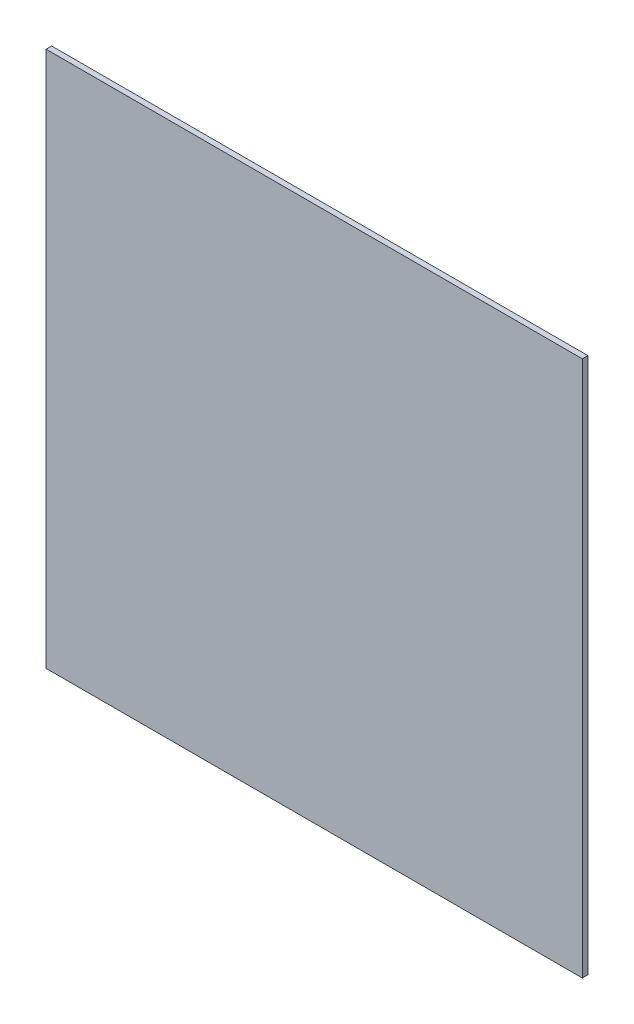
ISO-10303-21;
HEADER;
FILE_DESCRIPTION(('STEP AP214'),'2;1');
FILE_NAME('part.step','',(''),(''),'','','');
FILE_SCHEMA(('AUTOMOTIVE_DESIGN { 1 0 10303 214 1 1 1 1 }'));
ENDSEC;
DATA;
#1=APPLICATION_CONTEXT('core data for automotive mechanical design processes');
#2=APPLICATION_PROTOCOL_DEFINITION('international standard','automotive_design',2000,#1);
#3=PRODUCT_CONTEXT('',#1,'mechanical');
#4=PRODUCT('Part','Part','',(#3));
#5=PRODUCT_RELATED_PRODUCT_CATEGORY('part','',(#4));
#6=PRODUCT_DEFINITION_FORMATION('','',#4);
#7=PRODUCT_DEFINITION_CONTEXT('part definition',#1,'design');
#8=PRODUCT_DEFINITION('design','',#6,#7);
#9=PRODUCT_DEFINITION_SHAPE('','',#8);
#10=(LENGTH_UNIT() NAMED_UNIT(*) SI_UNIT(.MILLI.,.METRE.));
#11=(NAMED_UNIT(*) PLANE_ANGLE_UNIT() SI_UNIT($,.RADIAN.));
#12=(NAMED_UNIT(*) SI_UNIT($,.STERADIAN.) SOLID_ANGLE_UNIT());
#13=UNCERTAINTY_MEASURE_WITH_UNIT(LENGTH_MEASURE(1.E-05),#10,'distance_accuracy_value','');
#14=(GEOMETRIC_REPRESENTATION_CONTEXT(3) GLOBAL_UNCERTAINTY_ASSIGNED_CONTEXT((#13)) GLOBAL_UNIT_ASSIGNED_CONTEXT((#10,
#11,#12)) REPRESENTATION_CONTEXT('',''));
#15=CARTESIAN_POINT('',(0.,0.,0.));
#16=DIRECTION('',(0.,0.,1.));
#17=DIRECTION('',(1.,0.,0.));
#18=AXIS2_PLACEMENT_3D('',#15,#16,#17);
#19=CARTESIAN_POINT('',(1200.,-1200.,25.));
#20=DIRECTION('',(-1.,0.,0.));
#21=DIRECTION('',(0.,0.,1.));
#22=AXIS2_PLACEMENT_3D('',#19,#20,#21);
#23=PLANE('',#22);
#24=DIRECTION('',(0.,1.,0.));
#25=VECTOR('',#24,1.);
#26=CARTESIAN_POINT('',(1200.,-1200.,0.));
#27=LINE('',#26,#25);
#28=CARTESIAN_POINT('',(1200.,-1200.,0.));
#29=VERTEX_POINT('',#28);
#30=CARTESIAN_POINT('',(1200.,1200.,0.));
#31=VERTEX_POINT('',#30);
#32=EDGE_CURVE('E113',#29,#31,#27,.T.);
#33=ORIENTED_EDGE('',*,*,#32,.T.);
#34=DIRECTION('',(0.,0.,-1.));
#35=VECTOR('',#34,1.);
#36=CARTESIAN_POINT('',(1200.,1200.,25.));
#37=LINE('',#36,#35);
#38=CARTESIAN_POINT('',(1200.,1200.,25.));
#39=VERTEX_POINT('',#38);
#40=EDGE_CURVE('E11',#39,#31,#37,.T.);
#41=ORIENTED_EDGE('',*,*,#40,.F.);
#42=DIRECTION('',(0.,1.,0.));
#43=VECTOR('',#42,1.);
#44=CARTESIAN_POINT('',(1200.,-1200.,25.));
#45=LINE('',#44,#43);
#46=CARTESIAN_POINT('',(1200.,-1200.,25.));
#47=VERTEX_POINT('',#46);
#48=EDGE_CURVE('E97',#47,#39,#45,.T.);
#49=ORIENTED_EDGE('',*,*,#48,.F.);
#50=DIRECTION('',(0.,0.,-1.));
#51=VECTOR('',#50,1.);
#52=CARTESIAN_POINT('',(1200.,-1200.,25.));
#53=LINE('',#52,#51);
#54=EDGE_CURVE('E109',#47,#29,#53,.T.);
#55=ORIENTED_EDGE('',*,*,#54,.T.);
#56=EDGE_LOOP('',(#33,#41,#49,#55));
#57=FACE_BOUND('',#56,.T.);
#58=ADVANCED_FACE('F45',(#57),#23,.F.);
#59=CARTESIAN_POINT('',(-1200.,1200.,25.));
#60=DIRECTION('',(0.,-1.,0.));
#61=DIRECTION('',(0.,0.,-1.));
#62=AXIS2_PLACEMENT_3D('',#59,#60,#61);
#63=PLANE('',#62);
#64=DIRECTION('',(-1.,0.,0.));
#65=VECTOR('',#64,1.);
#66=CARTESIAN_POINT('',(-1200.,1200.,0.));
#67=LINE('',#66,#65);
#68=CARTESIAN_POINT('',(-1200.,1200.,0.));
#69=VERTEX_POINT('',#68);
#70=EDGE_CURVE('E102',#31,#69,#67,.T.);
#71=ORIENTED_EDGE('',*,*,#70,.T.);
#72=DIRECTION('',(0.,0.,-1.));
#73=VECTOR('',#72,1.);
#74=CARTESIAN_POINT('',(-1200.,1200.,25.));
#75=LINE('',#74,#73);
#76=CARTESIAN_POINT('',(-1200.,1200.,25.));
#77=VERTEX_POINT('',#76);
#78=EDGE_CURVE('E54',#77,#69,#75,.T.);
#79=ORIENTED_EDGE('',*,*,#78,.F.);
#80=DIRECTION('',(-1.,0.,0.));
#81=VECTOR('',#80,1.);
#82=CARTESIAN_POINT('',(-1200.,1200.,25.));
#83=LINE('',#82,#81);
#84=EDGE_CURVE('E92',#39,#77,#83,.T.);
#85=ORIENTED_EDGE('',*,*,#84,.F.);
#86=ORIENTED_EDGE('',*,*,#40,.T.);
#87=EDGE_LOOP('',(#71,#79,#85,#86));
#88=FACE_BOUND('',#87,.T.);
#89=ADVANCED_FACE('F101',(#88),#63,.F.);
#90=CARTESIAN_POINT('',(-1200.,-1200.,25.));
#91=DIRECTION('',(1.,0.,0.));
#92=DIRECTION('',(0.,0.,-1.));
#93=AXIS2_PLACEMENT_3D('',#90,#91,#92);
#94=PLANE('',#93);
#95=DIRECTION('',(0.,-1.,0.));
#96=VECTOR('',#95,1.);
#97=CARTESIAN_POINT('',(-1200.,-1200.,0.));
#98=LINE('',#97,#96);
#99=CARTESIAN_POINT('',(-1200.,-1200.,0.));
#100=VERTEX_POINT('',#99);
#101=EDGE_CURVE('E79',#69,#100,#98,.T.);
#102=ORIENTED_EDGE('',*,*,#101,.T.);
#103=DIRECTION('',(0.,0.,-1.));
#104=VECTOR('',#103,1.);
#105=CARTESIAN_POINT('',(-1200.,-1200.,25.));
#106=LINE('',#105,#104);
#107=CARTESIAN_POINT('',(-1200.,-1200.,25.));
#108=VERTEX_POINT('',#107);
#109=EDGE_CURVE('E104',#108,#100,#106,.T.);
#110=ORIENTED_EDGE('',*,*,#109,.F.);
#111=DIRECTION('',(0.,-1.,0.));
#112=VECTOR('',#111,1.);
#113=CARTESIAN_POINT('',(-1200.,-1200.,25.));
#114=LINE('',#113,#112);
#115=EDGE_CURVE('E95',#77,#108,#114,.T.);
#116=ORIENTED_EDGE('',*,*,#115,.F.);
#117=ORIENTED_EDGE('',*,*,#78,.T.);
#118=EDGE_LOOP('',(#102,#110,#116,#117));
#119=FACE_BOUND('',#118,.T.);
#120=ADVANCED_FACE('F105',(#119),#94,.F.);
#121=CARTESIAN_POINT('',(-1200.,-1200.,25.));
#122=DIRECTION('',(0.,1.,0.));
#123=DIRECTION('',(0.,0.,1.));
#124=AXIS2_PLACEMENT_3D('',#121,#122,#123);
#125=PLANE('',#124);
#126=DIRECTION('',(1.,0.,0.));
#127=VECTOR('',#126,1.);
#128=CARTESIAN_POINT('',(-1200.,-1200.,0.));
#129=LINE('',#128,#127);
#130=EDGE_CURVE('E85',#100,#29,#129,.T.);
#131=ORIENTED_EDGE('',*,*,#130,.T.);
#132=ORIENTED_EDGE('',*,*,#54,.F.);
#133=DIRECTION('',(1.,0.,0.));
#134=VECTOR('',#133,1.);
#135=CARTESIAN_POINT('',(-1200.,-1200.,25.));
#136=LINE('',#135,#134);
#137=EDGE_CURVE('E62',#108,#47,#136,.T.);
#138=ORIENTED_EDGE('',*,*,#137,.F.);
#139=ORIENTED_EDGE('',*,*,#109,.T.);
#140=EDGE_LOOP('',(#131,#132,#138,#139));
#141=FACE_BOUND('',#140,.T.);
#142=ADVANCED_FACE('F126',(#141),#125,.F.);
#143=CARTESIAN_POINT('',(0.,0.,25.));
#144=DIRECTION('',(0.,0.,-1.));
#145=DIRECTION('',(-1.,0.,0.));
#146=AXIS2_PLACEMENT_3D('',#143,#144,#145);
#147=PLANE('',#146);
#148=ORIENTED_EDGE('',*,*,#48,.T.);
#149=ORIENTED_EDGE('',*,*,#84,.T.);
#150=ORIENTED_EDGE('',*,*,#115,.T.);
#151=ORIENTED_EDGE('',*,*,#137,.T.);
#152=EDGE_LOOP('',(#148,#149,#150,#151));
#153=FACE_BOUND('',#152,.T.);
#154=ADVANCED_FACE('F93',(#153),#147,.F.);
#155=CARTESIAN_POINT('',(0.,0.,0.));
#156=DIRECTION('',(0.,0.,-1.));
#157=DIRECTION('',(-1.,0.,0.));
#158=AXIS2_PLACEMENT_3D('',#155,#156,#157);
#159=PLANE('',#158);
#160=ORIENTED_EDGE('',*,*,#32,.F.);
#161=ORIENTED_EDGE('',*,*,#130,.F.);
#162=ORIENTED_EDGE('',*,*,#101,.F.);
#163=ORIENTED_EDGE('',*,*,#70,.F.);
#164=EDGE_LOOP('',(#160,#161,#162,#163));
#165=FACE_BOUND('',#164,.T.);
#166=ADVANCED_FACE('F129',(#165),#159,.T.);
#167=CLOSED_SHELL('',(#58,#89,#120,#142,#154,#166));
#168=MANIFOLD_SOLID_BREP('B2',#167);
#169=ADVANCED_BREP_SHAPE_REPRESENTATION('',(#18,#168),#14);
#170=SHAPE_DEFINITION_REPRESENTATION(#9,#169);
ENDSEC;
END-ISO-10303-21;
